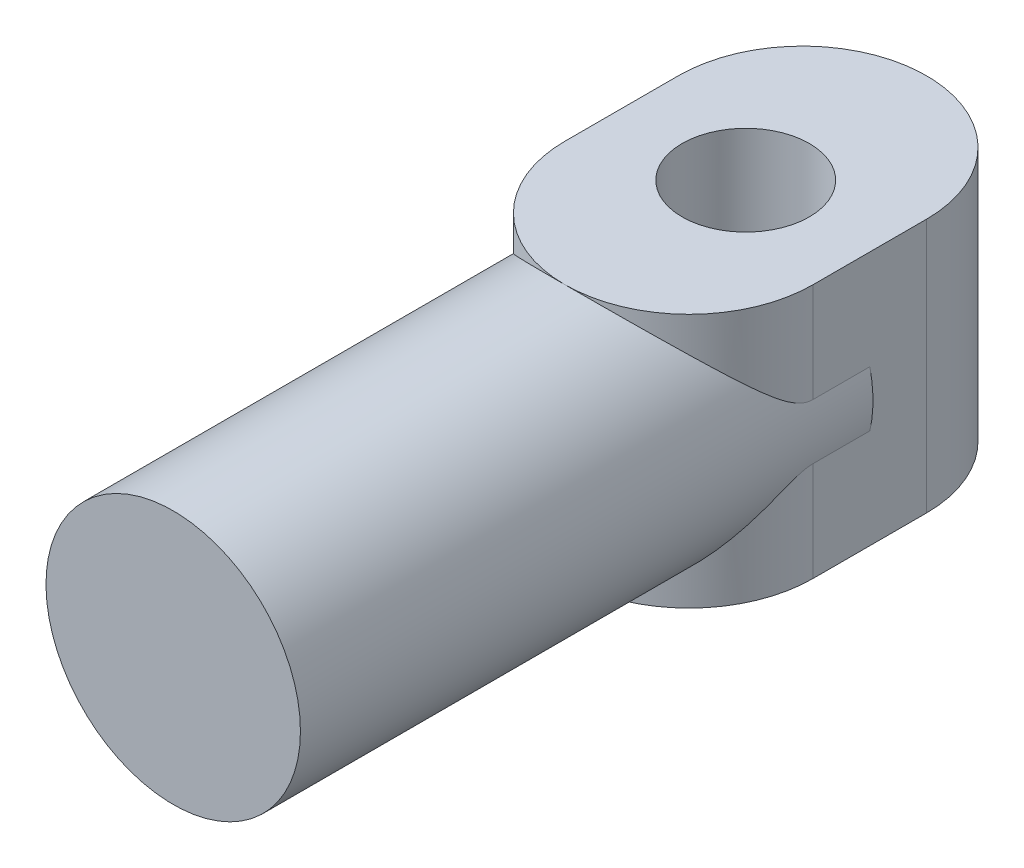
ISO-10303-21;
HEADER;
FILE_DESCRIPTION(('STEP AP214'),'2;1');
FILE_NAME('part.step','',(''),(''),'','','');
FILE_SCHEMA(('AUTOMOTIVE_DESIGN { 1 0 10303 214 1 1 1 1 }'));
ENDSEC;
DATA;
#1=APPLICATION_CONTEXT('core data for automotive mechanical design processes');
#2=APPLICATION_PROTOCOL_DEFINITION('international standard','automotive_design',2000,#1);
#3=PRODUCT_CONTEXT('',#1,'mechanical');
#4=PRODUCT('Part','Part','',(#3));
#5=PRODUCT_RELATED_PRODUCT_CATEGORY('part','',(#4));
#6=PRODUCT_DEFINITION_FORMATION('','',#4);
#7=PRODUCT_DEFINITION_CONTEXT('part definition',#1,'design');
#8=PRODUCT_DEFINITION('design','',#6,#7);
#9=PRODUCT_DEFINITION_SHAPE('','',#8);
#10=(LENGTH_UNIT() NAMED_UNIT(*) SI_UNIT(.MILLI.,.METRE.));
#11=(NAMED_UNIT(*) PLANE_ANGLE_UNIT() SI_UNIT($,.RADIAN.));
#12=(NAMED_UNIT(*) SI_UNIT($,.STERADIAN.) SOLID_ANGLE_UNIT());
#13=UNCERTAINTY_MEASURE_WITH_UNIT(LENGTH_MEASURE(1.E-05),#10,'distance_accuracy_value','');
#14=(GEOMETRIC_REPRESENTATION_CONTEXT(3) GLOBAL_UNCERTAINTY_ASSIGNED_CONTEXT((#13)) GLOBAL_UNIT_ASSIGNED_CONTEXT((#10,
#11,#12)) REPRESENTATION_CONTEXT('',''));
#15=CARTESIAN_POINT('',(0.,0.,0.));
#16=DIRECTION('',(0.,0.,1.));
#17=DIRECTION('',(1.,0.,0.));
#18=AXIS2_PLACEMENT_3D('',#15,#16,#17);
#19=CARTESIAN_POINT('',(0.,0.,22.5));
#20=DIRECTION('',(0.,0.,-1.));
#21=DIRECTION('',(-1.,0.,0.));
#22=AXIS2_PLACEMENT_3D('',#19,#20,#21);
#23=CYLINDRICAL_SURFACE('',#22,5.);
#24=CARTESIAN_POINT('',(0.,0.,22.5));
#25=DIRECTION('',(0.,0.,1.));
#26=DIRECTION('',(1.,0.,0.));
#27=AXIS2_PLACEMENT_3D('',#24,#25,#26);
#28=CIRCLE('',#27,5.);
#29=CARTESIAN_POINT('',(5.,0.,22.5));
#30=VERTEX_POINT('',#29);
#31=EDGE_CURVE('E145',#30,#30,#28,.T.);
#32=ORIENTED_EDGE('',*,*,#31,.F.);
#33=EDGE_LOOP('',(#32));
#34=FACE_BOUND('',#33,.T.);
#35=CARTESIAN_POINT('',(4.34010852188404,-2.48263126909124,0.));
#36=CARTESIAN_POINT('',(4.38095214984898,-2.41125293082914,0.0795351711029248));
#37=CARTESIAN_POINT('',(4.41955912858008,-2.33965078150296,0.160022604425833));
#38=CARTESIAN_POINT('',(4.49238129960369,-2.19657206959867,0.32320945993002));
#39=CARTESIAN_POINT('',(4.526592552409,-2.12509567552111,0.405910787127784));
#40=CARTESIAN_POINT('',(4.59096358073696,-1.98223568181697,0.574560227182173));
#41=CARTESIAN_POINT('',(4.62107776969885,-1.9108606957015,0.660533081541968));
#42=CARTESIAN_POINT('',(4.67682198510125,-1.77004410633439,0.835418717521394));
#43=CARTESIAN_POINT('',(4.70245409501467,-1.70060161746135,0.924330110199298));
#44=CARTESIAN_POINT('',(4.74916753619837,-1.56541254996443,1.10607633204091));
#45=CARTESIAN_POINT('',(4.77024946460314,-1.49966548721682,1.19891064447324));
#46=CARTESIAN_POINT('',(4.80760415828278,-1.37517713316143,1.3901722526468));
#47=CARTESIAN_POINT('',(4.82388224296115,-1.31642813607259,1.48859321701869));
#48=CARTESIAN_POINT('',(4.84640734487581,-1.2302944426525,1.65921174993277));
#49=CARTESIAN_POINT('',(4.85418847014866,-1.19899113436643,1.7291721597401));
#50=CARTESIAN_POINT('',(4.86686423879368,-1.14645854455357,1.87298094223218));
#51=CARTESIAN_POINT('',(4.87176894136504,-1.12519420703627,1.94681476988425));
#52=CARTESIAN_POINT('',(4.87759666177588,-1.09963665579278,2.08367990876941));
#53=CARTESIAN_POINT('',(4.87908349768438,-1.09295227106615,2.14621972959843));
#54=CARTESIAN_POINT('',(4.87962021808454,-1.09055449240175,2.27148174107562));
#55=CARTESIAN_POINT('',(4.8786720771154,-1.09483220921574,2.33420374278725));
#56=CARTESIAN_POINT('',(4.87390572329242,-1.11587547053816,2.47400260345505));
#57=CARTESIAN_POINT('',(4.86940823032182,-1.13558639564588,2.55059346753328));
#58=CARTESIAN_POINT('',(4.85728964097018,-1.18634133242209,2.69981318349904));
#59=CARTESIAN_POINT('',(4.84965237174098,-1.21744393022362,2.77241928188951));
#60=CARTESIAN_POINT('',(4.82786386375813,-1.30166352153247,2.94442303146283));
#61=CARTESIAN_POINT('',(4.81232407887642,-1.35847678594758,3.04177521599506));
#62=CARTESIAN_POINT('',(4.7765425186498,-1.47941638038418,3.23100694898059));
#63=CARTESIAN_POINT('',(4.75628902320835,-1.54356073259275,3.32287212715638));
#64=CARTESIAN_POINT('',(4.71122814179762,-1.67608504813768,3.50317938713791));
#65=CARTESIAN_POINT('',(4.68639446689298,-1.74448787026063,3.59159794313348));
#66=CARTESIAN_POINT('',(4.63237612032905,-1.88325450395528,3.76532342173608));
#67=CARTESIAN_POINT('',(4.60319597014001,-1.95361621664633,3.85063346456999));
#68=CARTESIAN_POINT('',(4.51114874235675,-2.1614666853567,4.09748426502577));
#69=CARTESIAN_POINT('',(4.44228568759614,-2.30023416799317,4.25575534941431));
#70=CARTESIAN_POINT('',(4.28778808651971,-2.57683586311907,4.56500499903995));
#71=CARTESIAN_POINT('',(4.20213823700674,-2.71466910442128,4.71597675230978));
#72=CARTESIAN_POINT('',(4.01382472594134,-2.98602849434052,5.00972531219506));
#73=CARTESIAN_POINT('',(3.91123167959463,-3.11956988067544,5.15253295182651));
#74=CARTESIAN_POINT('',(3.68815846950858,-3.38037391552647,5.4294129080461));
#75=CARTESIAN_POINT('',(3.56769268918454,-3.50764150427505,5.56349212529497));
#76=CARTESIAN_POINT('',(3.273221752419,-3.78647819604989,5.85585750624167));
#77=CARTESIAN_POINT('',(3.09351813878201,-3.93542816453882,6.01101071440105));
#78=CARTESIAN_POINT('',(2.70325868486523,-4.21303050140736,6.29914155037302));
#79=CARTESIAN_POINT('',(2.49273880920717,-4.34170617260846,6.43214464719722));
#80=CARTESIAN_POINT('',(2.08426121532525,-4.54949193781183,6.64645774575939));
#81=CARTESIAN_POINT('',(1.89143468113443,-4.63337329497289,6.73278642453082));
#82=CARTESIAN_POINT('',(1.58945045731665,-4.74184891368029,6.84430329569549));
#83=CARTESIAN_POINT('',(1.48663590652791,-4.77512293116609,6.87848626709218));
#84=CARTESIAN_POINT('',(1.27727187319332,-4.8353304297226,6.94031006409364));
#85=CARTESIAN_POINT('',(1.17072410800626,-4.86226678337595,6.96795385365103));
#86=CARTESIAN_POINT('',(0.953665743246638,-4.90947659311388,7.01638789063299));
#87=CARTESIAN_POINT('',(0.843129765650837,-4.92969345117867,7.03711992488421));
#88=CARTESIAN_POINT('',(0.619852388222282,-4.96271187937062,7.0709730041399));
#89=CARTESIAN_POINT('',(0.507112087686064,-4.97551705287938,7.08409774762932));
#90=CARTESIAN_POINT('',(0.280407101491237,-4.99342539550244,7.10245159515773));
#91=CARTESIAN_POINT('',(0.166442722187636,-4.99853044851421,7.10768263045713));
#92=CARTESIAN_POINT('',(-0.0616461326482274,-5.00092042016625,7.11013168451046));
#93=CARTESIAN_POINT('',(-0.175770590055362,-4.99820616235222,7.10735054712269));
#94=CARTESIAN_POINT('',(-0.389037064072173,-4.98584061305749,7.09467828379614));
#95=CARTESIAN_POINT('',(-0.488287849448057,-4.97708796647895,7.08570819577042));
#96=CARTESIAN_POINT('',(-0.685396060132195,-4.95379649015823,7.06183262575074));
#97=CARTESIAN_POINT('',(-0.783253048815831,-4.93925588683534,7.0469253244392));
#98=CARTESIAN_POINT('',(-1.07369229349495,-4.8873052628546,6.9936483491342));
#99=CARTESIAN_POINT('',(-1.2633211363008,-4.84155548715104,6.94671241549262));
#100=CARTESIAN_POINT('',(-1.63556643903343,-4.72904988074287,6.83116160892163));
#101=CARTESIAN_POINT('',(-1.81782160430716,-4.66172492332892,6.76195914498206));
#102=CARTESIAN_POINT('',(-2.16688950203758,-4.51008391890767,6.6058300402279));
#103=CARTESIAN_POINT('',(-2.33369624618589,-4.42576132296438,6.51889656776781));
#104=CARTESIAN_POINT('',(-2.73428370968894,-4.19542184487524,6.28089229657122));
#105=CARTESIAN_POINT('',(-2.95715054006336,-4.04028151100535,6.12013534811308));
#106=CARTESIAN_POINT('',(-3.26229755685508,-3.79141028093715,5.86075474594353));
#107=CARTESIAN_POINT('',(-3.35931416234643,-3.70557732865596,5.77106172942701));
#108=CARTESIAN_POINT('',(-3.54386251795339,-3.52948671568074,5.58636223563205));
#109=CARTESIAN_POINT('',(-3.63139487696939,-3.43922933958121,5.4913561000569));
#110=CARTESIAN_POINT('',(-3.82686720820016,-3.22232426671881,5.26191377117527));
#111=CARTESIAN_POINT('',(-3.93090028546689,-3.09421278991194,5.12553414363335));
#112=CARTESIAN_POINT('',(-4.12261365956553,-2.83376436687839,4.84539807803463));
#113=CARTESIAN_POINT('',(-4.21028333986653,-2.70142474219104,4.70163692744492));
#114=CARTESIAN_POINT('',(-4.36969194076287,-2.4351134352984,4.40747082635017));
#115=CARTESIAN_POINT('',(-4.4414577825763,-2.30114492234917,4.25707762789035));
#116=CARTESIAN_POINT('',(-4.53757965906716,-2.10139087261082,4.02584980805416));
#117=CARTESIAN_POINT('',(-4.5676915576541,-2.03502644158989,3.94785934369583));
#118=CARTESIAN_POINT('',(-4.62411028924676,-1.90334616950154,3.78965500837017));
#119=CARTESIAN_POINT('',(-4.6504177301906,-1.83803016238615,3.70944149508431));
#120=CARTESIAN_POINT('',(-4.70426590863372,-1.69610239793971,3.52939779977612));
#121=CARTESIAN_POINT('',(-4.73093570545451,-1.61994949229272,3.42894260896243));
#122=CARTESIAN_POINT('',(-4.77855656937687,-1.47352051467063,3.22235452984645));
#123=CARTESIAN_POINT('',(-4.79950805760637,-1.40324401018934,3.1162220603393));
#124=CARTESIAN_POINT('',(-4.82937823508402,-1.29582594604799,2.93077931709032));
#125=CARTESIAN_POINT('',(-4.84000174896804,-1.25527956837769,2.85376101777554));
#126=CARTESIAN_POINT('',(-4.8578460914355,-1.1843407479764,2.6947667459361));
#127=CARTESIAN_POINT('',(-4.8650765590247,-1.15391961379961,2.61280557300257));
#128=CARTESIAN_POINT('',(-4.87400878324667,-1.11549527469391,2.46710689586621));
#129=CARTESIAN_POINT('',(-4.87668009245046,-1.10364256161341,2.40448767805795));
#130=CARTESIAN_POINT('',(-4.87956357540016,-1.09082991628199,2.27816948554445));
#131=CARTESIAN_POINT('',(-4.8797818088453,-1.08984314261663,2.21447356096962));
#132=CARTESIAN_POINT('',(-4.87774826389305,-1.09890236663876,2.08807750647177));
#133=CARTESIAN_POINT('',(-4.8755008336752,-1.10892894240364,2.02537582074387));
#134=CARTESIAN_POINT('',(-4.86877857927819,-1.13807320945111,1.90216329931458));
#135=CARTESIAN_POINT('',(-4.86429696275259,-1.15721861572944,1.84165975189575));
#136=CARTESIAN_POINT('',(-4.85218885183154,-1.20708397799874,1.71010350781932));
#137=CARTESIAN_POINT('',(-4.84408199448379,-1.2394380455528,1.63973504259766));
#138=CARTESIAN_POINT('',(-4.82538530271713,-1.31034669305335,1.50248187636396));
#139=CARTESIAN_POINT('',(-4.81479032565737,-1.34891406258725,1.43560474625885));
#140=CARTESIAN_POINT('',(-4.79124789476054,-1.43029983987421,1.30407103098725));
#141=CARTESIAN_POINT('',(-4.77827927856751,-1.47315477541408,1.23944120438147));
#142=CARTESIAN_POINT('',(-4.75017851900571,-1.56139495011442,1.11240782224183));
#143=CARTESIAN_POINT('',(-4.73504558598245,-1.60678110909256,1.05000508969599));
#144=CARTESIAN_POINT('',(-4.69540031196579,-1.71995443357791,0.899286041194074));
#145=CARTESIAN_POINT('',(-4.66973154894309,-1.78863182198461,0.811944399990081));
#146=CARTESIAN_POINT('',(-4.61404238941791,-1.92775640832634,0.640049671434214));
#147=CARTESIAN_POINT('',(-4.58401972309159,-1.99820451345582,0.555498067012882));
#148=CARTESIAN_POINT('',(-4.52063141289367,-2.13765499465108,0.391338944972022));
#149=CARTESIAN_POINT('',(-4.48739966281812,-2.20663369227315,0.311659501561678));
#150=CARTESIAN_POINT('',(-4.41683990011144,-2.34468674950552,0.154357831152367));
#151=CARTESIAN_POINT('',(-4.37951551659943,-2.41376097158546,0.0767338561188069));
#152=CARTESIAN_POINT('',(-4.34010852188404,-2.48263126909124,0.));
#153=B_SPLINE_CURVE_WITH_KNOTS('',3,(#35,#36,#37,#38,#39,#40,#41,#42,#43,#44,#45,#46,#47,#48,
#49,#50,#51,#52,#53,#54,#55,#56,#57,#58,#59,#60,#61,#62,#63,#64,#65,#66,#67,#68,#69,#70,#71,#72,
#73,#74,#75,#76,#77,#78,#79,#80,#81,#82,#83,#84,#85,#86,#87,#88,#89,#90,#91,#92,#93,#94,#95,#96,
#97,#98,#99,#100,#101,#102,#103,#104,#105,#106,#107,#108,#109,#110,#111,#112,#113,#114,#115,
#116,#117,#118,#119,#120,#121,#122,#123,#124,#125,#126,#127,#128,#129,#130,#131,#132,#133,#134,
#135,#136,#137,#138,#139,#140,#141,#142,#143,#144,#145,#146,#147,#148,#149,#150,#151,#152),
.UNSPECIFIED.,.F.,.F.,(4,2,2,2,2,2,2,2,2,2,2,2,2,2,2,2,2,2,2,2,2,2,2,2,2,2,2,2,2,2,2,2,2,2,2,2,
2,2,2,2,2,2,2,2,2,2,2,2,2,2,2,2,2,2,2,2,2,2,4),(0.,0.343199736950259,0.686704938339106,
1.03376462294191,1.3806625471516,1.72751491914848,2.07398176007493,2.30458572052499,
2.53437834640289,2.722179488104,2.90982838868583,3.14604157932593,3.38348704948501,
3.72396554164641,4.06529981316648,4.40865792603613,4.75166131948944,5.4152296071177,
6.07940565516175,6.7408803738965,7.40182561743712,8.23976974838959,9.07674362667267,
9.75571127150324,10.0953760113909,10.4348864984104,10.7771881895212,11.1193233217471,
11.4613747342294,11.8033901224792,12.1031431110982,12.4029880226364,13.0021475231961,
13.61863129565,14.2353530456368,15.1764180094293,15.648787946683,16.1211275392096,
16.7625012471456,17.4042896411696,18.0449832058186,18.3651307971139,18.6852271733573,
19.071549867037,19.457844102091,19.7204573692618,19.982320016539,20.172843843482,
20.3628969260766,20.552615389426,20.7429141825795,20.9759707783662,21.2095133805128,
21.4452496830241,21.6810722147622,22.0230089132565,22.3651245190179,22.6965420165872,
23.0276679725783),.UNSPECIFIED.);
#154=CARTESIAN_POINT('',(4.87939679433956,-1.09155252891872,2.22979171558258));
#155=VERTEX_POINT('',#154);
#156=CARTESIAN_POINT('',(0.,-4.99999999999999,7.10918850992213));
#157=VERTEX_POINT('',#156);
#158=EDGE_CURVE('E11',#155,#157,#153,.T.);
#159=ORIENTED_EDGE('',*,*,#158,.F.);
#160=DIRECTION('',(0.,0.,-1.));
#161=VECTOR('',#160,1.);
#162=CARTESIAN_POINT('',(4.87939679433956,-1.09155252891872,22.5));
#163=LINE('',#162,#161);
#164=CARTESIAN_POINT('',(4.87939679433955,-1.09155252891874,0.));
#165=VERTEX_POINT('',#164);
#166=EDGE_CURVE('E140',#165,#155,#163,.F.);
#167=ORIENTED_EDGE('',*,*,#166,.F.);
#168=CARTESIAN_POINT('',(0.,0.,0.));
#169=DIRECTION('',(0.,0.,1.));
#170=DIRECTION('',(1.,0.,0.));
#171=AXIS2_PLACEMENT_3D('',#168,#169,#170);
#172=CIRCLE('',#171,5.);
#173=CARTESIAN_POINT('',(4.87939679433955,1.09155252891874,0.));
#174=VERTEX_POINT('',#173);
#175=EDGE_CURVE('E144',#165,#174,#172,.T.);
#176=ORIENTED_EDGE('',*,*,#175,.T.);
#177=DIRECTION('',(0.,0.,-1.));
#178=VECTOR('',#177,1.);
#179=CARTESIAN_POINT('',(4.87939679433956,1.09155252891872,22.5));
#180=LINE('',#179,#178);
#181=CARTESIAN_POINT('',(4.87939679433968,1.09155252892435,2.22979171559012));
#182=VERTEX_POINT('',#181);
#183=EDGE_CURVE('E142',#182,#174,#180,.T.);
#184=ORIENTED_EDGE('',*,*,#183,.F.);
#185=CARTESIAN_POINT('',(-4.34010852188404,2.48263126909124,0.));
#186=CARTESIAN_POINT('',(-4.38095214984898,2.41125293082914,0.0795351711029248));
#187=CARTESIAN_POINT('',(-4.41955912858008,2.33965078150296,0.160022604425833));
#188=CARTESIAN_POINT('',(-4.49238129960369,2.19657206959867,0.32320945993002));
#189=CARTESIAN_POINT('',(-4.526592552409,2.12509567552111,0.405910787127784));
#190=CARTESIAN_POINT('',(-4.59096358073696,1.98223568181697,0.574560227182173));
#191=CARTESIAN_POINT('',(-4.62107776969885,1.9108606957015,0.660533081541968));
#192=CARTESIAN_POINT('',(-4.67682198510125,1.77004410633439,0.835418717521394));
#193=CARTESIAN_POINT('',(-4.70245409501467,1.70060161746135,0.924330110199298));
#194=CARTESIAN_POINT('',(-4.74916753619837,1.56541254996443,1.10607633204091));
#195=CARTESIAN_POINT('',(-4.77024946460314,1.49966548721682,1.19891064447324));
#196=CARTESIAN_POINT('',(-4.80760415828278,1.37517713316143,1.3901722526468));
#197=CARTESIAN_POINT('',(-4.82388224296115,1.31642813607259,1.48859321701869));
#198=CARTESIAN_POINT('',(-4.84640734487581,1.2302944426525,1.65921174993277));
#199=CARTESIAN_POINT('',(-4.85418847014866,1.19899113436643,1.7291721597401));
#200=CARTESIAN_POINT('',(-4.86686423879368,1.14645854455357,1.87298094223218));
#201=CARTESIAN_POINT('',(-4.87176894136504,1.12519420703627,1.94681476988425));
#202=CARTESIAN_POINT('',(-4.87759666177588,1.09963665579278,2.08367990876941));
#203=CARTESIAN_POINT('',(-4.87908349768438,1.09295227106615,2.14621972959843));
#204=CARTESIAN_POINT('',(-4.87962021808454,1.09055449240175,2.27148174107562));
#205=CARTESIAN_POINT('',(-4.8786720771154,1.09483220921574,2.33420374278725));
#206=CARTESIAN_POINT('',(-4.87390572329242,1.11587547053816,2.47400260345505));
#207=CARTESIAN_POINT('',(-4.86940823032182,1.13558639564588,2.55059346753328));
#208=CARTESIAN_POINT('',(-4.85728964097018,1.18634133242209,2.69981318349904));
#209=CARTESIAN_POINT('',(-4.84965237174098,1.21744393022362,2.77241928188951));
#210=CARTESIAN_POINT('',(-4.82786386375813,1.30166352153247,2.94442303146283));
#211=CARTESIAN_POINT('',(-4.81232407887642,1.35847678594758,3.04177521599506));
#212=CARTESIAN_POINT('',(-4.7765425186498,1.47941638038418,3.23100694898059));
#213=CARTESIAN_POINT('',(-4.75628902320835,1.54356073259275,3.32287212715638));
#214=CARTESIAN_POINT('',(-4.71122814179762,1.67608504813768,3.50317938713791));
#215=CARTESIAN_POINT('',(-4.68639446689298,1.74448787026063,3.59159794313348));
#216=CARTESIAN_POINT('',(-4.63237612032905,1.88325450395528,3.76532342173608));
#217=CARTESIAN_POINT('',(-4.60319597014001,1.95361621664633,3.85063346456999));
#218=CARTESIAN_POINT('',(-4.51114874235675,2.1614666853567,4.09748426502577));
#219=CARTESIAN_POINT('',(-4.44228568759614,2.30023416799317,4.25575534941431));
#220=CARTESIAN_POINT('',(-4.28778808651971,2.57683586311907,4.56500499903995));
#221=CARTESIAN_POINT('',(-4.20213823700674,2.71466910442128,4.71597675230978));
#222=CARTESIAN_POINT('',(-4.01382472594134,2.98602849434052,5.00972531219506));
#223=CARTESIAN_POINT('',(-3.91123167959463,3.11956988067544,5.15253295182651));
#224=CARTESIAN_POINT('',(-3.68815846950858,3.38037391552647,5.4294129080461));
#225=CARTESIAN_POINT('',(-3.56769268918454,3.50764150427505,5.56349212529497));
#226=CARTESIAN_POINT('',(-3.273221752419,3.78647819604989,5.85585750624167));
#227=CARTESIAN_POINT('',(-3.09351813878201,3.93542816453882,6.01101071440105));
#228=CARTESIAN_POINT('',(-2.70325868486523,4.21303050140736,6.29914155037302));
#229=CARTESIAN_POINT('',(-2.49273880920717,4.34170617260846,6.43214464719722));
#230=CARTESIAN_POINT('',(-2.08426121532525,4.54949193781183,6.64645774575939));
#231=CARTESIAN_POINT('',(-1.89143468113443,4.63337329497289,6.73278642453082));
#232=CARTESIAN_POINT('',(-1.58945045731665,4.74184891368029,6.84430329569549));
#233=CARTESIAN_POINT('',(-1.48663590652791,4.77512293116609,6.87848626709218));
#234=CARTESIAN_POINT('',(-1.27727187319332,4.8353304297226,6.94031006409364));
#235=CARTESIAN_POINT('',(-1.17072410800626,4.86226678337595,6.96795385365103));
#236=CARTESIAN_POINT('',(-0.953665743246638,4.90947659311388,7.01638789063299));
#237=CARTESIAN_POINT('',(-0.843129765650837,4.92969345117867,7.03711992488421));
#238=CARTESIAN_POINT('',(-0.619852388222282,4.96271187937062,7.0709730041399));
#239=CARTESIAN_POINT('',(-0.507112087686064,4.97551705287938,7.08409774762932));
#240=CARTESIAN_POINT('',(-0.280407101491237,4.99342539550244,7.10245159515773));
#241=CARTESIAN_POINT('',(-0.166442722187636,4.99853044851421,7.10768263045713));
#242=CARTESIAN_POINT('',(0.0616461326482274,5.00092042016625,7.11013168451046));
#243=CARTESIAN_POINT('',(0.175770590055362,4.99820616235222,7.10735054712269));
#244=CARTESIAN_POINT('',(0.389037064072173,4.98584061305749,7.09467828379614));
#245=CARTESIAN_POINT('',(0.488287849448057,4.97708796647895,7.08570819577042));
#246=CARTESIAN_POINT('',(0.685396060132195,4.95379649015823,7.06183262575074));
#247=CARTESIAN_POINT('',(0.783253048815831,4.93925588683534,7.0469253244392));
#248=CARTESIAN_POINT('',(1.07369229349495,4.8873052628546,6.9936483491342));
#249=CARTESIAN_POINT('',(1.2633211363008,4.84155548715104,6.94671241549262));
#250=CARTESIAN_POINT('',(1.63556643903343,4.72904988074287,6.83116160892163));
#251=CARTESIAN_POINT('',(1.81782160430716,4.66172492332892,6.76195914498206));
#252=CARTESIAN_POINT('',(2.16688950203758,4.51008391890767,6.6058300402279));
#253=CARTESIAN_POINT('',(2.33369624618589,4.42576132296438,6.51889656776781));
#254=CARTESIAN_POINT('',(2.73428370968894,4.19542184487524,6.28089229657122));
#255=CARTESIAN_POINT('',(2.95715054006336,4.04028151100535,6.12013534811308));
#256=CARTESIAN_POINT('',(3.26229755685508,3.79141028093715,5.86075474594353));
#257=CARTESIAN_POINT('',(3.35931416234643,3.70557732865596,5.77106172942701));
#258=CARTESIAN_POINT('',(3.54386251795339,3.52948671568074,5.58636223563205));
#259=CARTESIAN_POINT('',(3.63139487696939,3.43922933958121,5.4913561000569));
#260=CARTESIAN_POINT('',(3.82686720820016,3.22232426671881,5.26191377117527));
#261=CARTESIAN_POINT('',(3.93090028546689,3.09421278991194,5.12553414363335));
#262=CARTESIAN_POINT('',(4.12261365956553,2.83376436687839,4.84539807803463));
#263=CARTESIAN_POINT('',(4.21028333986653,2.70142474219104,4.70163692744492));
#264=CARTESIAN_POINT('',(4.36969194076287,2.4351134352984,4.40747082635017));
#265=CARTESIAN_POINT('',(4.4414577825763,2.30114492234917,4.25707762789035));
#266=CARTESIAN_POINT('',(4.53757965906716,2.10139087261082,4.02584980805416));
#267=CARTESIAN_POINT('',(4.5676915576541,2.03502644158989,3.94785934369583));
#268=CARTESIAN_POINT('',(4.62411028924676,1.90334616950154,3.78965500837017));
#269=CARTESIAN_POINT('',(4.6504177301906,1.83803016238615,3.70944149508431));
#270=CARTESIAN_POINT('',(4.70426590863372,1.69610239793971,3.52939779977612));
#271=CARTESIAN_POINT('',(4.73093570545451,1.61994949229272,3.42894260896243));
#272=CARTESIAN_POINT('',(4.77855656937687,1.47352051467063,3.22235452984645));
#273=CARTESIAN_POINT('',(4.79950805760637,1.40324401018934,3.1162220603393));
#274=CARTESIAN_POINT('',(4.82937823508402,1.29582594604799,2.93077931709032));
#275=CARTESIAN_POINT('',(4.84000174896804,1.25527956837769,2.85376101777554));
#276=CARTESIAN_POINT('',(4.8578460914355,1.1843407479764,2.6947667459361));
#277=CARTESIAN_POINT('',(4.8650765590247,1.15391961379961,2.61280557300257));
#278=CARTESIAN_POINT('',(4.87400878324667,1.11549527469391,2.46710689586621));
#279=CARTESIAN_POINT('',(4.87668009245046,1.10364256161341,2.40448767805795));
#280=CARTESIAN_POINT('',(4.87956357540016,1.09082991628199,2.27816948554445));
#281=CARTESIAN_POINT('',(4.8797818088453,1.08984314261663,2.21447356096962));
#282=CARTESIAN_POINT('',(4.87774826389305,1.09890236663876,2.08807750647177));
#283=CARTESIAN_POINT('',(4.8755008336752,1.10892894240364,2.02537582074387));
#284=CARTESIAN_POINT('',(4.86877857927819,1.13807320945111,1.90216329931458));
#285=CARTESIAN_POINT('',(4.86429696275259,1.15721861572944,1.84165975189575));
#286=CARTESIAN_POINT('',(4.85218885183154,1.20708397799874,1.71010350781932));
#287=CARTESIAN_POINT('',(4.84408199448379,1.2394380455528,1.63973504259766));
#288=CARTESIAN_POINT('',(4.82538530271713,1.31034669305335,1.50248187636396));
#289=CARTESIAN_POINT('',(4.81479032565737,1.34891406258725,1.43560474625885));
#290=CARTESIAN_POINT('',(4.79124789476054,1.43029983987421,1.30407103098725));
#291=CARTESIAN_POINT('',(4.77827927856751,1.47315477541408,1.23944120438147));
#292=CARTESIAN_POINT('',(4.75017851900571,1.56139495011442,1.11240782224183));
#293=CARTESIAN_POINT('',(4.73504558598245,1.60678110909256,1.05000508969599));
#294=CARTESIAN_POINT('',(4.69540031196579,1.71995443357791,0.899286041194074));
#295=CARTESIAN_POINT('',(4.66973154894309,1.78863182198461,0.811944399990081));
#296=CARTESIAN_POINT('',(4.61404238941791,1.92775640832634,0.640049671434214));
#297=CARTESIAN_POINT('',(4.58401972309159,1.99820451345582,0.555498067012882));
#298=CARTESIAN_POINT('',(4.52063141289367,2.13765499465108,0.391338944972022));
#299=CARTESIAN_POINT('',(4.48739966281812,2.20663369227315,0.311659501561678));
#300=CARTESIAN_POINT('',(4.41683990011144,2.34468674950552,0.154357831152367));
#301=CARTESIAN_POINT('',(4.37951551659943,2.41376097158546,0.0767338561188069));
#302=CARTESIAN_POINT('',(4.34010852188404,2.48263126909124,0.));
#303=B_SPLINE_CURVE_WITH_KNOTS('',3,(#185,#186,#187,#188,#189,#190,#191,#192,#193,#194,#195,
#196,#197,#198,#199,#200,#201,#202,#203,#204,#205,#206,#207,#208,#209,#210,#211,#212,#213,#214,
#215,#216,#217,#218,#219,#220,#221,#222,#223,#224,#225,#226,#227,#228,#229,#230,#231,#232,#233,
#234,#235,#236,#237,#238,#239,#240,#241,#242,#243,#244,#245,#246,#247,#248,#249,#250,#251,#252,
#253,#254,#255,#256,#257,#258,#259,#260,#261,#262,#263,#264,#265,#266,#267,#268,#269,#270,#271,
#272,#273,#274,#275,#276,#277,#278,#279,#280,#281,#282,#283,#284,#285,#286,#287,#288,#289,#290,
#291,#292,#293,#294,#295,#296,#297,#298,#299,#300,#301,#302),.UNSPECIFIED.,.F.,.F.,(4,2,2,2,2,2,
2,2,2,2,2,2,2,2,2,2,2,2,2,2,2,2,2,2,2,2,2,2,2,2,2,2,2,2,2,2,2,2,2,2,2,2,2,2,2,2,2,2,2,2,2,2,2,2,
2,2,2,2,4),(0.,0.343199736950259,0.686704938339106,1.03376462294191,1.3806625471516,
1.72751491914848,2.07398176007493,2.30458572052499,2.53437834640289,2.722179488104,
2.90982838868583,3.14604157932593,3.38348704948501,3.72396554164641,4.06529981316648,
4.40865792603613,4.75166131948944,5.4152296071177,6.07940565516175,6.7408803738965,
7.40182561743712,8.23976974838959,9.07674362667267,9.75571127150324,10.0953760113909,
10.4348864984104,10.7771881895212,11.1193233217471,11.4613747342294,11.8033901224792,
12.1031431110982,12.4029880226364,13.0021475231961,13.61863129565,14.2353530456368,
15.1764180094293,15.648787946683,16.1211275392096,16.7625012471456,17.4042896411696,
18.0449832058186,18.3651307971139,18.6852271733573,19.071549867037,19.457844102091,
19.7204573692618,19.982320016539,20.172843843482,20.3628969260766,20.552615389426,
20.7429141825795,20.9759707783662,21.2095133805128,21.4452496830241,21.6810722147622,
22.0230089132565,22.3651245190179,22.6965420165872,23.0276679725783),.UNSPECIFIED.);
#304=CARTESIAN_POINT('',(0.,4.99999999999999,7.10918850992213));
#305=VERTEX_POINT('',#304);
#306=EDGE_CURVE('E36',#305,#182,#303,.T.);
#307=ORIENTED_EDGE('',*,*,#306,.F.);
#308=CARTESIAN_POINT('',(-4.87939679433955,1.09155252891876,2.22979171558258));
#309=VERTEX_POINT('',#308);
#310=EDGE_CURVE('E46',#309,#305,#303,.T.);
#311=ORIENTED_EDGE('',*,*,#310,.F.);
#312=DIRECTION('',(0.,0.,-1.));
#313=VECTOR('',#312,1.);
#314=CARTESIAN_POINT('',(-4.87939679433955,1.09155252891876,22.5));
#315=LINE('',#314,#313);
#316=CARTESIAN_POINT('',(-4.87939679433955,1.09155252891873,0.));
#317=VERTEX_POINT('',#316);
#318=EDGE_CURVE('E130',#317,#309,#315,.F.);
#319=ORIENTED_EDGE('',*,*,#318,.F.);
#320=CARTESIAN_POINT('',(-4.87939679433955,-1.09155252891873,0.));
#321=VERTEX_POINT('',#320);
#322=EDGE_CURVE('E149',#317,#321,#172,.T.);
#323=ORIENTED_EDGE('',*,*,#322,.T.);
#324=DIRECTION('',(0.,0.,-1.));
#325=VECTOR('',#324,1.);
#326=CARTESIAN_POINT('',(-4.87939679433955,-1.09155252891876,22.5));
#327=LINE('',#326,#325);
#328=CARTESIAN_POINT('',(-4.87939679433968,-1.09155252892435,2.22979171559012));
#329=VERTEX_POINT('',#328);
#330=EDGE_CURVE('E133',#329,#321,#327,.T.);
#331=ORIENTED_EDGE('',*,*,#330,.F.);
#332=EDGE_CURVE('E47',#157,#329,#153,.T.);
#333=ORIENTED_EDGE('',*,*,#332,.F.);
#334=EDGE_LOOP('',(#159,#167,#176,#184,#307,#311,#319,#323,#331,#333));
#335=FACE_BOUND('',#334,.T.);
#336=ADVANCED_FACE('F32',(#34,#335),#23,.T.);
#337=CARTESIAN_POINT('',(0.,0.,0.));
#338=DIRECTION('',(0.,0.,1.));
#339=DIRECTION('',(1.,0.,0.));
#340=AXIS2_PLACEMENT_3D('',#337,#338,#339);
#341=PLANE('',#340);
#342=DIRECTION('',(0.,-1.,0.));
#343=VECTOR('',#342,1.);
#344=CARTESIAN_POINT('',(4.87939679433955,0.,0.));
#345=LINE('',#344,#343);
#346=EDGE_CURVE('E154',#174,#165,#345,.T.);
#347=ORIENTED_EDGE('',*,*,#346,.F.);
#348=ORIENTED_EDGE('',*,*,#175,.F.);
#349=EDGE_LOOP('',(#347,#348));
#350=FACE_BOUND('',#349,.T.);
#351=ADVANCED_FACE('F174',(#350),#341,.F.);
#352=DIRECTION('',(0.,1.,0.));
#353=VECTOR('',#352,1.);
#354=CARTESIAN_POINT('',(-4.87939679433955,0.,0.));
#355=LINE('',#354,#353);
#356=EDGE_CURVE('E148',#321,#317,#355,.T.);
#357=ORIENTED_EDGE('',*,*,#356,.F.);
#358=ORIENTED_EDGE('',*,*,#322,.F.);
#359=EDGE_LOOP('',(#357,#358));
#360=FACE_BOUND('',#359,.T.);
#361=ADVANCED_FACE('F172',(#360),#341,.F.);
#362=CARTESIAN_POINT('',(0.,0.,22.5));
#363=DIRECTION('',(0.,0.,1.));
#364=DIRECTION('',(1.,0.,0.));
#365=AXIS2_PLACEMENT_3D('',#362,#363,#364);
#366=PLANE('',#365);
#367=ORIENTED_EDGE('',*,*,#31,.T.);
#368=EDGE_LOOP('',(#367));
#369=FACE_BOUND('',#368,.T.);
#370=ADVANCED_FACE('F167',(#369),#366,.T.);
#371=CARTESIAN_POINT('',(0.,4.99999999999999,2.22979171558258));
#372=DIRECTION('',(0.,-1.,0.));
#373=DIRECTION('',(0.,0.,-1.));
#374=AXIS2_PLACEMENT_3D('',#371,#372,#373);
#375=CYLINDRICAL_SURFACE('',#374,4.87939679433955);
#376=DIRECTION('',(0.,-1.,0.));
#377=VECTOR('',#376,1.);
#378=CARTESIAN_POINT('',(4.87939679433955,4.99999999999999,2.22979171558258));
#379=LINE('',#378,#377);
#380=CARTESIAN_POINT('',(4.87939679433955,-4.99999999999999,2.22979171558258));
#381=VERTEX_POINT('',#380);
#382=EDGE_CURVE('E131',#155,#381,#379,.T.);
#383=ORIENTED_EDGE('',*,*,#382,.F.);
#384=ORIENTED_EDGE('',*,*,#158,.T.);
#385=CARTESIAN_POINT('',(0.,-4.99999999999999,2.22979171558258));
#386=DIRECTION('',(0.,1.,0.));
#387=DIRECTION('',(0.,0.,1.));
#388=AXIS2_PLACEMENT_3D('',#385,#386,#387);
#389=CIRCLE('',#388,4.87939679433955);
#390=EDGE_CURVE('E187',#157,#381,#389,.T.);
#391=ORIENTED_EDGE('',*,*,#390,.T.);
#392=EDGE_LOOP('',(#383,#384,#391));
#393=FACE_BOUND('',#392,.T.);
#394=ADVANCED_FACE('F161',(#393),#375,.T.);
#395=CARTESIAN_POINT('',(-4.87939679433955,-4.99999999999999,2.22979171558258));
#396=VERTEX_POINT('',#395);
#397=EDGE_CURVE('E192',#396,#157,#389,.T.);
#398=ORIENTED_EDGE('',*,*,#397,.T.);
#399=ORIENTED_EDGE('',*,*,#332,.T.);
#400=DIRECTION('',(0.,-1.,0.));
#401=VECTOR('',#400,1.);
#402=CARTESIAN_POINT('',(-4.87939679433955,4.99999999999999,2.22979171558258));
#403=LINE('',#402,#401);
#404=EDGE_CURVE('E209',#329,#396,#403,.T.);
#405=ORIENTED_EDGE('',*,*,#404,.T.);
#406=EDGE_LOOP('',(#398,#399,#405));
#407=FACE_BOUND('',#406,.T.);
#408=ADVANCED_FACE('F166',(#407),#375,.T.);
#409=CARTESIAN_POINT('',(-4.87939679433955,4.99999999999999,2.22979171558258));
#410=VERTEX_POINT('',#409);
#411=EDGE_CURVE('E206',#410,#309,#403,.T.);
#412=ORIENTED_EDGE('',*,*,#411,.T.);
#413=ORIENTED_EDGE('',*,*,#310,.T.);
#414=CARTESIAN_POINT('',(0.,4.99999999999999,2.22979171558258));
#415=DIRECTION('',(0.,1.,0.));
#416=DIRECTION('',(0.,0.,1.));
#417=AXIS2_PLACEMENT_3D('',#414,#415,#416);
#418=CIRCLE('',#417,4.87939679433955);
#419=EDGE_CURVE('E113',#410,#305,#418,.T.);
#420=ORIENTED_EDGE('',*,*,#419,.F.);
#421=EDGE_LOOP('',(#412,#413,#420));
#422=FACE_BOUND('',#421,.T.);
#423=ADVANCED_FACE('F281',(#422),#375,.T.);
#424=CARTESIAN_POINT('',(4.87939679433955,4.99999999999999,2.22979171558258));
#425=VERTEX_POINT('',#424);
#426=EDGE_CURVE('E107',#305,#425,#418,.T.);
#427=ORIENTED_EDGE('',*,*,#426,.F.);
#428=ORIENTED_EDGE('',*,*,#306,.T.);
#429=EDGE_CURVE('E123',#425,#182,#379,.T.);
#430=ORIENTED_EDGE('',*,*,#429,.F.);
#431=EDGE_LOOP('',(#427,#428,#430));
#432=FACE_BOUND('',#431,.T.);
#433=ADVANCED_FACE('F129',(#432),#375,.T.);
#434=CARTESIAN_POINT('',(4.87939679433955,4.99999999999999,2.22979171558258));
#435=DIRECTION('',(-1.,0.,0.));
#436=DIRECTION('',(0.,0.,1.));
#437=AXIS2_PLACEMENT_3D('',#434,#435,#436);
#438=PLANE('',#437);
#439=ORIENTED_EDGE('',*,*,#429,.T.);
#440=ORIENTED_EDGE('',*,*,#183,.T.);
#441=ORIENTED_EDGE('',*,*,#346,.T.);
#442=ORIENTED_EDGE('',*,*,#166,.T.);
#443=ORIENTED_EDGE('',*,*,#382,.T.);
#444=DIRECTION('',(0.,0.,-1.));
#445=VECTOR('',#444,1.);
#446=CARTESIAN_POINT('',(4.87939679433955,-4.99999999999999,2.22979171558258));
#447=LINE('',#446,#445);
#448=CARTESIAN_POINT('',(4.87939679433955,-4.99999999999999,-2.22979171558258));
#449=VERTEX_POINT('',#448);
#450=EDGE_CURVE('E196',#381,#449,#447,.T.);
#451=ORIENTED_EDGE('',*,*,#450,.T.);
#452=DIRECTION('',(0.,-1.,0.));
#453=VECTOR('',#452,1.);
#454=CARTESIAN_POINT('',(4.87939679433955,4.99999999999999,-2.22979171558258));
#455=LINE('',#454,#453);
#456=CARTESIAN_POINT('',(4.87939679433955,4.99999999999999,-2.22979171558258));
#457=VERTEX_POINT('',#456);
#458=EDGE_CURVE('E125',#457,#449,#455,.T.);
#459=ORIENTED_EDGE('',*,*,#458,.F.);
#460=DIRECTION('',(0.,0.,-1.));
#461=VECTOR('',#460,1.);
#462=CARTESIAN_POINT('',(4.87939679433955,4.99999999999999,2.22979171558258));
#463=LINE('',#462,#461);
#464=EDGE_CURVE('E110',#425,#457,#463,.T.);
#465=ORIENTED_EDGE('',*,*,#464,.F.);
#466=EDGE_LOOP('',(#439,#440,#441,#442,#443,#451,#459,#465));
#467=FACE_BOUND('',#466,.T.);
#468=ADVANCED_FACE('F121',(#467),#438,.F.);
#469=CARTESIAN_POINT('',(-4.87939679433955,4.99999999999999,2.22979171558258));
#470=DIRECTION('',(1.,0.,0.));
#471=DIRECTION('',(0.,0.,-1.));
#472=AXIS2_PLACEMENT_3D('',#469,#470,#471);
#473=PLANE('',#472);
#474=ORIENTED_EDGE('',*,*,#404,.F.);
#475=ORIENTED_EDGE('',*,*,#330,.T.);
#476=ORIENTED_EDGE('',*,*,#356,.T.);
#477=ORIENTED_EDGE('',*,*,#318,.T.);
#478=ORIENTED_EDGE('',*,*,#411,.F.);
#479=DIRECTION('',(0.,0.,1.));
#480=VECTOR('',#479,1.);
#481=CARTESIAN_POINT('',(-4.87939679433955,4.99999999999999,2.22979171558258));
#482=LINE('',#481,#480);
#483=CARTESIAN_POINT('',(-4.87939679433955,4.99999999999999,-2.22979171558258));
#484=VERTEX_POINT('',#483);
#485=EDGE_CURVE('E216',#484,#410,#482,.T.);
#486=ORIENTED_EDGE('',*,*,#485,.F.);
#487=DIRECTION('',(0.,-1.,0.));
#488=VECTOR('',#487,1.);
#489=CARTESIAN_POINT('',(-4.87939679433955,4.99999999999999,-2.22979171558258));
#490=LINE('',#489,#488);
#491=CARTESIAN_POINT('',(-4.87939679433955,-4.99999999999999,-2.22979171558258));
#492=VERTEX_POINT('',#491);
#493=EDGE_CURVE('E208',#484,#492,#490,.T.);
#494=ORIENTED_EDGE('',*,*,#493,.T.);
#495=DIRECTION('',(0.,0.,1.));
#496=VECTOR('',#495,1.);
#497=CARTESIAN_POINT('',(-4.87939679433955,-4.99999999999999,2.22979171558258));
#498=LINE('',#497,#496);
#499=EDGE_CURVE('E117',#492,#396,#498,.T.);
#500=ORIENTED_EDGE('',*,*,#499,.T.);
#501=EDGE_LOOP('',(#474,#475,#476,#477,#478,#486,#494,#500));
#502=FACE_BOUND('',#501,.T.);
#503=ADVANCED_FACE('F238',(#502),#473,.F.);
#504=CARTESIAN_POINT('',(0.,4.99999999999999,-2.22979171558258));
#505=DIRECTION('',(0.,-1.,0.));
#506=DIRECTION('',(0.,0.,-1.));
#507=AXIS2_PLACEMENT_3D('',#504,#505,#506);
#508=CYLINDRICAL_SURFACE('',#507,4.87939679433955);
#509=CARTESIAN_POINT('',(0.,-4.99999999999999,-2.22979171558258));
#510=DIRECTION('',(0.,1.,0.));
#511=DIRECTION('',(0.,0.,1.));
#512=AXIS2_PLACEMENT_3D('',#509,#510,#511);
#513=CIRCLE('',#512,4.87939679433955);
#514=EDGE_CURVE('E199',#449,#492,#513,.T.);
#515=ORIENTED_EDGE('',*,*,#514,.T.);
#516=ORIENTED_EDGE('',*,*,#493,.F.);
#517=CARTESIAN_POINT('',(0.,4.99999999999999,-2.22979171558258));
#518=DIRECTION('',(0.,1.,0.));
#519=DIRECTION('',(0.,0.,1.));
#520=AXIS2_PLACEMENT_3D('',#517,#518,#519);
#521=CIRCLE('',#520,4.87939679433955);
#522=EDGE_CURVE('E127',#457,#484,#521,.T.);
#523=ORIENTED_EDGE('',*,*,#522,.F.);
#524=ORIENTED_EDGE('',*,*,#458,.T.);
#525=EDGE_LOOP('',(#515,#516,#523,#524));
#526=FACE_BOUND('',#525,.T.);
#527=ADVANCED_FACE('F215',(#526),#508,.T.);
#528=CARTESIAN_POINT('',(0.,4.99999999999999,2.22979171558258));
#529=DIRECTION('',(0.,1.,0.));
#530=DIRECTION('',(0.,0.,1.));
#531=AXIS2_PLACEMENT_3D('',#528,#529,#530);
#532=PLANE('',#531);
#533=CARTESIAN_POINT('',(0.,4.99999999999999,0.));
#534=DIRECTION('',(0.,1.,0.));
#535=DIRECTION('',(0.,0.,1.));
#536=AXIS2_PLACEMENT_3D('',#533,#534,#535);
#537=CIRCLE('',#536,2.5);
#538=CARTESIAN_POINT('',(0.,4.99999999999999,2.5));
#539=VERTEX_POINT('',#538);
#540=EDGE_CURVE('E193',#539,#539,#537,.T.);
#541=ORIENTED_EDGE('',*,*,#540,.F.);
#542=EDGE_LOOP('',(#541));
#543=FACE_BOUND('',#542,.T.);
#544=ORIENTED_EDGE('',*,*,#419,.T.);
#545=ORIENTED_EDGE('',*,*,#426,.T.);
#546=ORIENTED_EDGE('',*,*,#464,.T.);
#547=ORIENTED_EDGE('',*,*,#522,.T.);
#548=ORIENTED_EDGE('',*,*,#485,.T.);
#549=EDGE_LOOP('',(#544,#545,#546,#547,#548));
#550=FACE_BOUND('',#549,.T.);
#551=ADVANCED_FACE('F109',(#543,#550),#532,.T.);
#552=CARTESIAN_POINT('',(0.,-4.99999999999999,2.22979171558258));
#553=DIRECTION('',(0.,1.,0.));
#554=DIRECTION('',(0.,0.,1.));
#555=AXIS2_PLACEMENT_3D('',#552,#553,#554);
#556=PLANE('',#555);
#557=CARTESIAN_POINT('',(0.,-4.99999999999999,0.));
#558=DIRECTION('',(0.,-1.,0.));
#559=DIRECTION('',(0.,0.,-1.));
#560=AXIS2_PLACEMENT_3D('',#557,#558,#559);
#561=CIRCLE('',#560,2.5);
#562=CARTESIAN_POINT('',(0.,-4.99999999999999,-2.5));
#563=VERTEX_POINT('',#562);
#564=EDGE_CURVE('E221',#563,#563,#561,.T.);
#565=ORIENTED_EDGE('',*,*,#564,.F.);
#566=EDGE_LOOP('',(#565));
#567=FACE_BOUND('',#566,.T.);
#568=ORIENTED_EDGE('',*,*,#397,.F.);
#569=ORIENTED_EDGE('',*,*,#499,.F.);
#570=ORIENTED_EDGE('',*,*,#514,.F.);
#571=ORIENTED_EDGE('',*,*,#450,.F.);
#572=ORIENTED_EDGE('',*,*,#390,.F.);
#573=EDGE_LOOP('',(#568,#569,#570,#571,#572));
#574=FACE_BOUND('',#573,.T.);
#575=ADVANCED_FACE('F197',(#567,#574),#556,.F.);
#576=CARTESIAN_POINT('',(0.,10.,0.));
#577=DIRECTION('',(0.,-1.,0.));
#578=DIRECTION('',(0.,0.,-1.));
#579=AXIS2_PLACEMENT_3D('',#576,#577,#578);
#580=CYLINDRICAL_SURFACE('',#579,2.5);
#581=ORIENTED_EDGE('',*,*,#540,.T.);
#582=EDGE_LOOP('',(#581));
#583=FACE_BOUND('',#582,.T.);
#584=ORIENTED_EDGE('',*,*,#564,.T.);
#585=EDGE_LOOP('',(#584));
#586=FACE_BOUND('',#585,.T.);
#587=ADVANCED_FACE('F225',(#583,#586),#580,.F.);
#588=CLOSED_SHELL('',(#336,#351,#361,#370,#394,#408,#423,#433,#468,#503,#527,#551,#575,#587));
#589=MANIFOLD_SOLID_BREP('B2',#588);
#590=ADVANCED_BREP_SHAPE_REPRESENTATION('',(#18,#589),#14);
#591=SHAPE_DEFINITION_REPRESENTATION(#9,#590);
ENDSEC;
END-ISO-10303-21;
